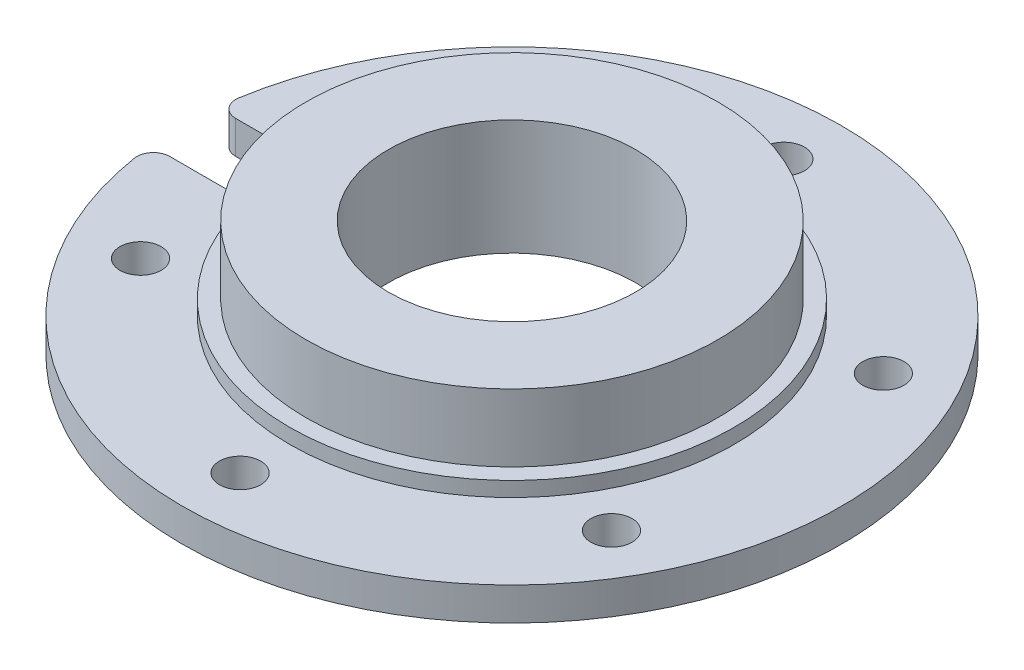
ISO-10303-21;
HEADER;
FILE_DESCRIPTION(('STEP AP214'),'2;1');
FILE_NAME('part.step','',(''),(''),'','','');
FILE_SCHEMA(('AUTOMOTIVE_DESIGN { 1 0 10303 214 1 1 1 1 }'));
ENDSEC;
DATA;
#1=APPLICATION_CONTEXT('core data for automotive mechanical design processes');
#2=APPLICATION_PROTOCOL_DEFINITION('international standard','automotive_design',2000,#1);
#3=PRODUCT_CONTEXT('',#1,'mechanical');
#4=PRODUCT('Part','Part','',(#3));
#5=PRODUCT_RELATED_PRODUCT_CATEGORY('part','',(#4));
#6=PRODUCT_DEFINITION_FORMATION('','',#4);
#7=PRODUCT_DEFINITION_CONTEXT('part definition',#1,'design');
#8=PRODUCT_DEFINITION('design','',#6,#7);
#9=PRODUCT_DEFINITION_SHAPE('','',#8);
#10=(LENGTH_UNIT() NAMED_UNIT(*) SI_UNIT(.MILLI.,.METRE.));
#11=(NAMED_UNIT(*) PLANE_ANGLE_UNIT() SI_UNIT($,.RADIAN.));
#12=(NAMED_UNIT(*) SI_UNIT($,.STERADIAN.) SOLID_ANGLE_UNIT());
#13=UNCERTAINTY_MEASURE_WITH_UNIT(LENGTH_MEASURE(1.E-05),#10,'distance_accuracy_value','');
#14=(GEOMETRIC_REPRESENTATION_CONTEXT(3) GLOBAL_UNCERTAINTY_ASSIGNED_CONTEXT((#13)) GLOBAL_UNIT_ASSIGNED_CONTEXT((#10,
#11,#12)) REPRESENTATION_CONTEXT('',''));
#15=CARTESIAN_POINT('',(0.,0.,0.));
#16=DIRECTION('',(0.,0.,1.));
#17=DIRECTION('',(1.,0.,0.));
#18=AXIS2_PLACEMENT_3D('',#15,#16,#17);
#19=CARTESIAN_POINT('',(0.,0.,0.));
#20=DIRECTION('',(0.,1.,0.));
#21=DIRECTION('',(0.,0.,1.));
#22=AXIS2_PLACEMENT_3D('',#19,#20,#21);
#23=PLANE('',#22);
#24=CARTESIAN_POINT('',(-14.2894191624432,0.,8.25000000000001));
#25=DIRECTION('',(0.,-1.,0.));
#26=DIRECTION('',(0.,0.,-1.));
#27=AXIS2_PLACEMENT_3D('',#24,#25,#26);
#28=CIRCLE('',#27,1.25);
#29=CARTESIAN_POINT('',(-14.2894191624432,0.,7.00000000000001));
#30=VERTEX_POINT('',#29);
#31=EDGE_CURVE('E188',#30,#30,#28,.T.);
#32=ORIENTED_EDGE('',*,*,#31,.F.);
#33=EDGE_LOOP('',(#32));
#34=FACE_BOUND('',#33,.T.);
#35=CARTESIAN_POINT('',(0.,0.,16.5));
#36=DIRECTION('',(0.,-1.,0.));
#37=DIRECTION('',(0.,0.,-1.));
#38=AXIS2_PLACEMENT_3D('',#35,#36,#37);
#39=CIRCLE('',#38,1.25);
#40=CARTESIAN_POINT('',(0.,0.,15.25));
#41=VERTEX_POINT('',#40);
#42=EDGE_CURVE('E172',#41,#41,#39,.T.);
#43=ORIENTED_EDGE('',*,*,#42,.F.);
#44=EDGE_LOOP('',(#43));
#45=FACE_BOUND('',#44,.T.);
#46=CARTESIAN_POINT('',(14.2894191624432,0.,8.25));
#47=DIRECTION('',(0.,-1.,0.));
#48=DIRECTION('',(0.,0.,-1.));
#49=AXIS2_PLACEMENT_3D('',#46,#47,#48);
#50=CIRCLE('',#49,1.25);
#51=CARTESIAN_POINT('',(14.2894191624432,0.,7.));
#52=VERTEX_POINT('',#51);
#53=EDGE_CURVE('E171',#52,#52,#50,.T.);
#54=ORIENTED_EDGE('',*,*,#53,.F.);
#55=EDGE_LOOP('',(#54));
#56=FACE_BOUND('',#55,.T.);
#57=CARTESIAN_POINT('',(14.2894191624432,0.,-8.25));
#58=DIRECTION('',(0.,-1.,0.));
#59=DIRECTION('',(0.,0.,-1.));
#60=AXIS2_PLACEMENT_3D('',#57,#58,#59);
#61=CIRCLE('',#60,1.25);
#62=CARTESIAN_POINT('',(14.2894191624432,0.,-9.5));
#63=VERTEX_POINT('',#62);
#64=EDGE_CURVE('E167',#63,#63,#61,.T.);
#65=ORIENTED_EDGE('',*,*,#64,.F.);
#66=EDGE_LOOP('',(#65));
#67=FACE_BOUND('',#66,.T.);
#68=CARTESIAN_POINT('',(0.,0.,-16.5));
#69=DIRECTION('',(0.,-1.,0.));
#70=DIRECTION('',(0.,0.,-1.));
#71=AXIS2_PLACEMENT_3D('',#68,#69,#70);
#72=CIRCLE('',#71,1.25);
#73=CARTESIAN_POINT('',(0.,0.,-17.75));
#74=VERTEX_POINT('',#73);
#75=EDGE_CURVE('E166',#74,#74,#72,.T.);
#76=ORIENTED_EDGE('',*,*,#75,.F.);
#77=EDGE_LOOP('',(#76));
#78=FACE_BOUND('',#77,.T.);
#79=CARTESIAN_POINT('',(0.,0.,0.));
#80=DIRECTION('',(0.,1.,0.));
#81=DIRECTION('',(0.,0.,1.));
#82=AXIS2_PLACEMENT_3D('',#79,#80,#81);
#83=CIRCLE('',#82,7.5);
#84=CARTESIAN_POINT('',(0.,0.,7.5));
#85=VERTEX_POINT('',#84);
#86=EDGE_CURVE('E246',#85,#85,#83,.T.);
#87=ORIENTED_EDGE('',*,*,#86,.T.);
#88=EDGE_LOOP('',(#87));
#89=FACE_BOUND('',#88,.T.);
#90=CARTESIAN_POINT('',(0.,0.,0.));
#91=DIRECTION('',(0.,1.,0.));
#92=DIRECTION('',(0.,0.,1.));
#93=AXIS2_PLACEMENT_3D('',#90,#91,#92);
#94=CIRCLE('',#93,20.);
#95=CARTESIAN_POINT('',(-19.7491189887302,0.,3.1578947368421));
#96=VERTEX_POINT('',#95);
#97=CARTESIAN_POINT('',(-19.7491189887302,0.,-3.15789473684211));
#98=VERTEX_POINT('',#97);
#99=EDGE_CURVE('E250',#96,#98,#94,.T.);
#100=ORIENTED_EDGE('',*,*,#99,.F.);
#101=CARTESIAN_POINT('',(-18.7616630392937,0.,3.));
#102=DIRECTION('',(0.,1.,0.));
#103=DIRECTION('',(0.,0.,1.));
#104=AXIS2_PLACEMENT_3D('',#101,#102,#103);
#105=CIRCLE('',#104,1.);
#106=CARTESIAN_POINT('',(-18.7616630392937,0.,2.));
#107=VERTEX_POINT('',#106);
#108=EDGE_CURVE('E150',#96,#107,#105,.F.);
#109=ORIENTED_EDGE('',*,*,#108,.T.);
#110=DIRECTION('',(-1.,0.,0.));
#111=VECTOR('',#110,1.);
#112=CARTESIAN_POINT('',(-23.1889342613165,0.,2.));
#113=LINE('',#112,#111);
#114=CARTESIAN_POINT('',(-15.,0.,2.));
#115=VERTEX_POINT('',#114);
#116=EDGE_CURVE('E121',#115,#107,#113,.T.);
#117=ORIENTED_EDGE('',*,*,#116,.F.);
#118=CARTESIAN_POINT('',(-15.,0.,0.999999999999997));
#119=DIRECTION('',(0.,1.,0.));
#120=DIRECTION('',(0.,0.,1.));
#121=AXIS2_PLACEMENT_3D('',#118,#119,#120);
#122=CIRCLE('',#121,1.);
#123=CARTESIAN_POINT('',(-14.,0.,0.999999999999997));
#124=VERTEX_POINT('',#123);
#125=EDGE_CURVE('E156',#115,#124,#122,.T.);
#126=ORIENTED_EDGE('',*,*,#125,.T.);
#127=DIRECTION('',(0.,0.,1.));
#128=VECTOR('',#127,1.);
#129=CARTESIAN_POINT('',(-14.,0.,2.));
#130=LINE('',#129,#128);
#131=CARTESIAN_POINT('',(-14.,0.,-1.));
#132=VERTEX_POINT('',#131);
#133=EDGE_CURVE('E215',#132,#124,#130,.T.);
#134=ORIENTED_EDGE('',*,*,#133,.F.);
#135=CARTESIAN_POINT('',(-15.,0.,-1.));
#136=DIRECTION('',(0.,1.,0.));
#137=DIRECTION('',(0.,0.,1.));
#138=AXIS2_PLACEMENT_3D('',#135,#136,#137);
#139=CIRCLE('',#138,1.);
#140=CARTESIAN_POINT('',(-15.,0.,-2.));
#141=VERTEX_POINT('',#140);
#142=EDGE_CURVE('E55',#132,#141,#139,.T.);
#143=ORIENTED_EDGE('',*,*,#142,.T.);
#144=DIRECTION('',(1.,0.,0.));
#145=VECTOR('',#144,1.);
#146=CARTESIAN_POINT('',(-23.1889342613165,0.,-2.));
#147=LINE('',#146,#145);
#148=CARTESIAN_POINT('',(-18.7616630392937,0.,-2.));
#149=VERTEX_POINT('',#148);
#150=EDGE_CURVE('E212',#149,#141,#147,.T.);
#151=ORIENTED_EDGE('',*,*,#150,.F.);
#152=CARTESIAN_POINT('',(-18.7616630392937,0.,-3.));
#153=DIRECTION('',(0.,1.,0.));
#154=DIRECTION('',(0.,0.,1.));
#155=AXIS2_PLACEMENT_3D('',#152,#153,#154);
#156=CIRCLE('',#155,1.);
#157=EDGE_CURVE('E271',#149,#98,#156,.F.);
#158=ORIENTED_EDGE('',*,*,#157,.T.);
#159=EDGE_LOOP('',(#100,#109,#117,#126,#134,#143,#151,#158));
#160=FACE_BOUND('',#159,.T.);
#161=CARTESIAN_POINT('',(-14.2894191624432,0.,-8.25));
#162=DIRECTION('',(0.,-1.,0.));
#163=DIRECTION('',(0.,0.,-1.));
#164=AXIS2_PLACEMENT_3D('',#161,#162,#163);
#165=CIRCLE('',#164,1.25);
#166=CARTESIAN_POINT('',(-14.2894191624432,0.,-9.5));
#167=VERTEX_POINT('',#166);
#168=EDGE_CURVE('E204',#167,#167,#165,.T.);
#169=ORIENTED_EDGE('',*,*,#168,.F.);
#170=EDGE_LOOP('',(#169));
#171=FACE_BOUND('',#170,.T.);
#172=ADVANCED_FACE('F45',(#34,#45,#56,#67,#78,#89,#160,#171),#23,.F.);
#173=CARTESIAN_POINT('',(0.,2.,0.));
#174=DIRECTION('',(0.,1.,0.));
#175=DIRECTION('',(0.,0.,1.));
#176=AXIS2_PLACEMENT_3D('',#173,#174,#175);
#177=PLANE('',#176);
#178=CARTESIAN_POINT('',(-14.2894191624432,2.,8.25000000000001));
#179=DIRECTION('',(0.,1.,0.));
#180=DIRECTION('',(0.,0.,1.));
#181=AXIS2_PLACEMENT_3D('',#178,#179,#180);
#182=CIRCLE('',#181,1.25);
#183=CARTESIAN_POINT('',(-14.2894191624432,2.,9.50000000000001));
#184=VERTEX_POINT('',#183);
#185=EDGE_CURVE('E49',#184,#184,#182,.T.);
#186=ORIENTED_EDGE('',*,*,#185,.F.);
#187=EDGE_LOOP('',(#186));
#188=FACE_BOUND('',#187,.T.);
#189=CARTESIAN_POINT('',(0.,2.,16.5));
#190=DIRECTION('',(0.,1.,0.));
#191=DIRECTION('',(0.,0.,1.));
#192=AXIS2_PLACEMENT_3D('',#189,#190,#191);
#193=CIRCLE('',#192,1.25);
#194=CARTESIAN_POINT('',(0.,2.,17.75));
#195=VERTEX_POINT('',#194);
#196=EDGE_CURVE('E168',#195,#195,#193,.T.);
#197=ORIENTED_EDGE('',*,*,#196,.F.);
#198=EDGE_LOOP('',(#197));
#199=FACE_BOUND('',#198,.T.);
#200=CARTESIAN_POINT('',(14.2894191624432,2.,8.25));
#201=DIRECTION('',(0.,1.,0.));
#202=DIRECTION('',(0.,0.,1.));
#203=AXIS2_PLACEMENT_3D('',#200,#201,#202);
#204=CIRCLE('',#203,1.25);
#205=CARTESIAN_POINT('',(14.2894191624432,2.,9.49999999999999));
#206=VERTEX_POINT('',#205);
#207=EDGE_CURVE('E179',#206,#206,#204,.T.);
#208=ORIENTED_EDGE('',*,*,#207,.F.);
#209=EDGE_LOOP('',(#208));
#210=FACE_BOUND('',#209,.T.);
#211=CARTESIAN_POINT('',(14.2894191624432,2.,-8.25));
#212=DIRECTION('',(0.,1.,0.));
#213=DIRECTION('',(0.,0.,1.));
#214=AXIS2_PLACEMENT_3D('',#211,#212,#213);
#215=CIRCLE('',#214,1.25);
#216=CARTESIAN_POINT('',(14.2894191624432,2.,-7.));
#217=VERTEX_POINT('',#216);
#218=EDGE_CURVE('E163',#217,#217,#215,.T.);
#219=ORIENTED_EDGE('',*,*,#218,.F.);
#220=EDGE_LOOP('',(#219));
#221=FACE_BOUND('',#220,.T.);
#222=CARTESIAN_POINT('',(0.,2.,-16.5));
#223=DIRECTION('',(0.,1.,0.));
#224=DIRECTION('',(0.,0.,1.));
#225=AXIS2_PLACEMENT_3D('',#222,#223,#224);
#226=CIRCLE('',#225,1.25);
#227=CARTESIAN_POINT('',(0.,2.,-15.25));
#228=VERTEX_POINT('',#227);
#229=EDGE_CURVE('E200',#228,#228,#226,.T.);
#230=ORIENTED_EDGE('',*,*,#229,.F.);
#231=EDGE_LOOP('',(#230));
#232=FACE_BOUND('',#231,.T.);
#233=CARTESIAN_POINT('',(-14.2894191624432,2.,-8.25));
#234=DIRECTION('',(0.,1.,0.));
#235=DIRECTION('',(0.,0.,1.));
#236=AXIS2_PLACEMENT_3D('',#233,#234,#235);
#237=CIRCLE('',#236,1.25);
#238=CARTESIAN_POINT('',(-14.2894191624432,2.,-7.00000000000001));
#239=VERTEX_POINT('',#238);
#240=EDGE_CURVE('E208',#239,#239,#237,.T.);
#241=ORIENTED_EDGE('',*,*,#240,.F.);
#242=EDGE_LOOP('',(#241));
#243=FACE_BOUND('',#242,.T.);
#244=DIRECTION('',(1.,0.,0.));
#245=VECTOR('',#244,1.);
#246=CARTESIAN_POINT('',(0.,2.,2.));
#247=LINE('',#246,#245);
#248=CARTESIAN_POINT('',(-18.7616630392937,2.,2.));
#249=VERTEX_POINT('',#248);
#250=CARTESIAN_POINT('',(-15.,2.,2.));
#251=VERTEX_POINT('',#250);
#252=EDGE_CURVE('E118',#249,#251,#247,.T.);
#253=ORIENTED_EDGE('',*,*,#252,.F.);
#254=CARTESIAN_POINT('',(-18.7616630392937,2.,3.));
#255=DIRECTION('',(0.,1.,0.));
#256=DIRECTION('',(0.,0.,1.));
#257=AXIS2_PLACEMENT_3D('',#254,#255,#256);
#258=CIRCLE('',#257,1.);
#259=CARTESIAN_POINT('',(-19.7491189887302,2.,3.1578947368421));
#260=VERTEX_POINT('',#259);
#261=EDGE_CURVE('E130',#249,#260,#258,.T.);
#262=ORIENTED_EDGE('',*,*,#261,.T.);
#263=CARTESIAN_POINT('',(0.,2.,0.));
#264=DIRECTION('',(0.,1.,0.));
#265=DIRECTION('',(0.,0.,1.));
#266=AXIS2_PLACEMENT_3D('',#263,#264,#265);
#267=CIRCLE('',#266,20.);
#268=CARTESIAN_POINT('',(-19.7491189887302,2.,-3.15789473684211));
#269=VERTEX_POINT('',#268);
#270=EDGE_CURVE('E126',#260,#269,#267,.T.);
#271=ORIENTED_EDGE('',*,*,#270,.T.);
#272=CARTESIAN_POINT('',(-18.7616630392937,2.,-3.));
#273=DIRECTION('',(0.,1.,0.));
#274=DIRECTION('',(0.,0.,1.));
#275=AXIS2_PLACEMENT_3D('',#272,#273,#274);
#276=CIRCLE('',#275,1.);
#277=CARTESIAN_POINT('',(-18.7616630392937,2.,-2.));
#278=VERTEX_POINT('',#277);
#279=EDGE_CURVE('E63',#269,#278,#276,.T.);
#280=ORIENTED_EDGE('',*,*,#279,.T.);
#281=DIRECTION('',(-1.,0.,0.));
#282=VECTOR('',#281,1.);
#283=CARTESIAN_POINT('',(0.,2.,-2.));
#284=LINE('',#283,#282);
#285=CARTESIAN_POINT('',(-15.,2.,-2.));
#286=VERTEX_POINT('',#285);
#287=EDGE_CURVE('E137',#286,#278,#284,.T.);
#288=ORIENTED_EDGE('',*,*,#287,.F.);
#289=CARTESIAN_POINT('',(-15.,2.,-1.));
#290=DIRECTION('',(0.,1.,0.));
#291=DIRECTION('',(0.,0.,1.));
#292=AXIS2_PLACEMENT_3D('',#289,#290,#291);
#293=CIRCLE('',#292,1.);
#294=CARTESIAN_POINT('',(-14.,2.,-1.));
#295=VERTEX_POINT('',#294);
#296=EDGE_CURVE('E11',#286,#295,#293,.F.);
#297=ORIENTED_EDGE('',*,*,#296,.T.);
#298=DIRECTION('',(0.,0.,-1.));
#299=VECTOR('',#298,1.);
#300=CARTESIAN_POINT('',(-14.,2.,0.));
#301=LINE('',#300,#299);
#302=CARTESIAN_POINT('',(-14.,2.,0.999999999999997));
#303=VERTEX_POINT('',#302);
#304=EDGE_CURVE('E136',#303,#295,#301,.T.);
#305=ORIENTED_EDGE('',*,*,#304,.F.);
#306=CARTESIAN_POINT('',(-15.,2.,0.999999999999997));
#307=DIRECTION('',(0.,1.,0.));
#308=DIRECTION('',(0.,0.,1.));
#309=AXIS2_PLACEMENT_3D('',#306,#307,#308);
#310=CIRCLE('',#309,1.);
#311=EDGE_CURVE('E134',#303,#251,#310,.F.);
#312=ORIENTED_EDGE('',*,*,#311,.T.);
#313=EDGE_LOOP('',(#253,#262,#271,#280,#288,#297,#305,#312));
#314=FACE_BOUND('',#313,.T.);
#315=CARTESIAN_POINT('',(0.,2.,0.));
#316=DIRECTION('',(0.,1.,0.));
#317=DIRECTION('',(0.,0.,1.));
#318=AXIS2_PLACEMENT_3D('',#315,#316,#317);
#319=CIRCLE('',#318,13.5);
#320=CARTESIAN_POINT('',(0.,2.,13.5));
#321=VERTEX_POINT('',#320);
#322=EDGE_CURVE('E230',#321,#321,#319,.T.);
#323=ORIENTED_EDGE('',*,*,#322,.F.);
#324=EDGE_LOOP('',(#323));
#325=FACE_BOUND('',#324,.T.);
#326=ADVANCED_FACE('F128',(#188,#199,#210,#221,#232,#243,#314,#325),#177,.T.);
#327=CARTESIAN_POINT('',(0.,2.,0.));
#328=DIRECTION('',(0.,-1.,0.));
#329=DIRECTION('',(0.,0.,-1.));
#330=AXIS2_PLACEMENT_3D('',#327,#328,#329);
#331=CYLINDRICAL_SURFACE('',#330,20.);
#332=ORIENTED_EDGE('',*,*,#270,.F.);
#333=DIRECTION('',(0.,-1.,0.));
#334=VECTOR('',#333,1.);
#335=CARTESIAN_POINT('',(-19.7491189887302,2.,3.1578947368421));
#336=LINE('',#335,#334);
#337=EDGE_CURVE('E142',#260,#96,#336,.T.);
#338=ORIENTED_EDGE('',*,*,#337,.T.);
#339=ORIENTED_EDGE('',*,*,#99,.T.);
#340=DIRECTION('',(0.,-1.,0.));
#341=VECTOR('',#340,1.);
#342=CARTESIAN_POINT('',(-19.7491189887302,2.,-3.15789473684211));
#343=LINE('',#342,#341);
#344=EDGE_CURVE('E265',#98,#269,#343,.F.);
#345=ORIENTED_EDGE('',*,*,#344,.T.);
#346=EDGE_LOOP('',(#332,#338,#339,#345));
#347=FACE_BOUND('',#346,.T.);
#348=ADVANCED_FACE('F279',(#347),#331,.T.);
#349=CARTESIAN_POINT('',(0.,2.,0.));
#350=DIRECTION('',(0.,-1.,0.));
#351=DIRECTION('',(0.,0.,-1.));
#352=AXIS2_PLACEMENT_3D('',#349,#350,#351);
#353=CYLINDRICAL_SURFACE('',#352,7.5);
#354=ORIENTED_EDGE('',*,*,#86,.F.);
#355=EDGE_LOOP('',(#354));
#356=FACE_BOUND('',#355,.T.);
#357=CARTESIAN_POINT('',(0.,7.,0.));
#358=DIRECTION('',(0.,1.,0.));
#359=DIRECTION('',(0.,0.,1.));
#360=AXIS2_PLACEMENT_3D('',#357,#358,#359);
#361=CIRCLE('',#360,7.5);
#362=CARTESIAN_POINT('',(0.,7.,7.5));
#363=VERTEX_POINT('',#362);
#364=EDGE_CURVE('E235',#363,#363,#361,.T.);
#365=ORIENTED_EDGE('',*,*,#364,.T.);
#366=EDGE_LOOP('',(#365));
#367=FACE_BOUND('',#366,.T.);
#368=ADVANCED_FACE('F318',(#356,#367),#353,.F.);
#369=CARTESIAN_POINT('',(0.,7.,0.));
#370=DIRECTION('',(0.,1.,0.));
#371=DIRECTION('',(0.,0.,1.));
#372=AXIS2_PLACEMENT_3D('',#369,#370,#371);
#373=PLANE('',#372);
#374=CARTESIAN_POINT('',(0.,7.,0.));
#375=DIRECTION('',(0.,1.,0.));
#376=DIRECTION('',(0.,0.,1.));
#377=AXIS2_PLACEMENT_3D('',#374,#375,#376);
#378=CIRCLE('',#377,12.5);
#379=CARTESIAN_POINT('',(0.,7.,12.5));
#380=VERTEX_POINT('',#379);
#381=EDGE_CURVE('E242',#380,#380,#378,.T.);
#382=ORIENTED_EDGE('',*,*,#381,.T.);
#383=EDGE_LOOP('',(#382));
#384=FACE_BOUND('',#383,.T.);
#385=ORIENTED_EDGE('',*,*,#364,.F.);
#386=EDGE_LOOP('',(#385));
#387=FACE_BOUND('',#386,.T.);
#388=ADVANCED_FACE('F324',(#384,#387),#373,.T.);
#389=CARTESIAN_POINT('',(0.,7.,0.));
#390=DIRECTION('',(0.,-1.,0.));
#391=DIRECTION('',(0.,0.,-1.));
#392=AXIS2_PLACEMENT_3D('',#389,#390,#391);
#393=CYLINDRICAL_SURFACE('',#392,12.5);
#394=CARTESIAN_POINT('',(0.,2.9,0.));
#395=DIRECTION('',(0.,1.,0.));
#396=DIRECTION('',(0.,0.,1.));
#397=AXIS2_PLACEMENT_3D('',#394,#395,#396);
#398=CIRCLE('',#397,12.5);
#399=CARTESIAN_POINT('',(0.,2.9,12.5));
#400=VERTEX_POINT('',#399);
#401=EDGE_CURVE('E226',#400,#400,#398,.T.);
#402=ORIENTED_EDGE('',*,*,#401,.T.);
#403=EDGE_LOOP('',(#402));
#404=FACE_BOUND('',#403,.T.);
#405=ORIENTED_EDGE('',*,*,#381,.F.);
#406=EDGE_LOOP('',(#405));
#407=FACE_BOUND('',#406,.T.);
#408=ADVANCED_FACE('F329',(#404,#407),#393,.T.);
#409=CARTESIAN_POINT('',(0.,2.9,0.));
#410=DIRECTION('',(0.,1.,0.));
#411=DIRECTION('',(0.,0.,1.));
#412=AXIS2_PLACEMENT_3D('',#409,#410,#411);
#413=PLANE('',#412);
#414=CARTESIAN_POINT('',(0.,2.9,0.));
#415=DIRECTION('',(0.,1.,0.));
#416=DIRECTION('',(0.,0.,1.));
#417=AXIS2_PLACEMENT_3D('',#414,#415,#416);
#418=CIRCLE('',#417,13.5);
#419=CARTESIAN_POINT('',(0.,2.9,13.5));
#420=VERTEX_POINT('',#419);
#421=EDGE_CURVE('E231',#420,#420,#418,.T.);
#422=ORIENTED_EDGE('',*,*,#421,.T.);
#423=EDGE_LOOP('',(#422));
#424=FACE_BOUND('',#423,.T.);
#425=ORIENTED_EDGE('',*,*,#401,.F.);
#426=EDGE_LOOP('',(#425));
#427=FACE_BOUND('',#426,.T.);
#428=ADVANCED_FACE('F336',(#424,#427),#413,.T.);
#429=CARTESIAN_POINT('',(0.,2.9,0.));
#430=DIRECTION('',(0.,-1.,0.));
#431=DIRECTION('',(0.,0.,-1.));
#432=AXIS2_PLACEMENT_3D('',#429,#430,#431);
#433=CYLINDRICAL_SURFACE('',#432,13.5);
#434=ORIENTED_EDGE('',*,*,#421,.F.);
#435=EDGE_LOOP('',(#434));
#436=FACE_BOUND('',#435,.T.);
#437=ORIENTED_EDGE('',*,*,#322,.T.);
#438=EDGE_LOOP('',(#437));
#439=FACE_BOUND('',#438,.T.);
#440=ADVANCED_FACE('F339',(#436,#439),#433,.T.);
#441=CARTESIAN_POINT('',(-23.1889342613165,10.,2.));
#442=DIRECTION('',(0.,0.,1.));
#443=DIRECTION('',(1.,0.,0.));
#444=AXIS2_PLACEMENT_3D('',#441,#442,#443);
#445=PLANE('',#444);
#446=ORIENTED_EDGE('',*,*,#252,.T.);
#447=DIRECTION('',(0.,-1.,0.));
#448=VECTOR('',#447,1.);
#449=CARTESIAN_POINT('',(-15.,0.,2.));
#450=LINE('',#449,#448);
#451=EDGE_CURVE('E125',#251,#115,#450,.T.);
#452=ORIENTED_EDGE('',*,*,#451,.T.);
#453=ORIENTED_EDGE('',*,*,#116,.T.);
#454=DIRECTION('',(0.,-1.,0.));
#455=VECTOR('',#454,1.);
#456=CARTESIAN_POINT('',(-18.7616630392937,10.,2.));
#457=LINE('',#456,#455);
#458=EDGE_CURVE('E114',#107,#249,#457,.F.);
#459=ORIENTED_EDGE('',*,*,#458,.T.);
#460=EDGE_LOOP('',(#446,#452,#453,#459));
#461=FACE_BOUND('',#460,.T.);
#462=ADVANCED_FACE('F116',(#461),#445,.F.);
#463=CARTESIAN_POINT('',(-14.,10.,2.));
#464=DIRECTION('',(1.,0.,0.));
#465=DIRECTION('',(0.,0.,-1.));
#466=AXIS2_PLACEMENT_3D('',#463,#464,#465);
#467=PLANE('',#466);
#468=ORIENTED_EDGE('',*,*,#133,.T.);
#469=DIRECTION('',(0.,-1.,0.));
#470=VECTOR('',#469,1.);
#471=CARTESIAN_POINT('',(-14.,2.,0.999999999999997));
#472=LINE('',#471,#470);
#473=EDGE_CURVE('E262',#124,#303,#472,.F.);
#474=ORIENTED_EDGE('',*,*,#473,.T.);
#475=ORIENTED_EDGE('',*,*,#304,.T.);
#476=DIRECTION('',(0.,-1.,0.));
#477=VECTOR('',#476,1.);
#478=CARTESIAN_POINT('',(-14.,0.,-1.));
#479=LINE('',#478,#477);
#480=EDGE_CURVE('E258',#295,#132,#479,.T.);
#481=ORIENTED_EDGE('',*,*,#480,.T.);
#482=EDGE_LOOP('',(#468,#474,#475,#481));
#483=FACE_BOUND('',#482,.T.);
#484=ADVANCED_FACE('F292',(#483),#467,.F.);
#485=CARTESIAN_POINT('',(-23.1889342613165,10.,-2.));
#486=DIRECTION('',(0.,0.,-1.));
#487=DIRECTION('',(-1.,0.,0.));
#488=AXIS2_PLACEMENT_3D('',#485,#486,#487);
#489=PLANE('',#488);
#490=ORIENTED_EDGE('',*,*,#287,.T.);
#491=DIRECTION('',(0.,-1.,0.));
#492=VECTOR('',#491,1.);
#493=CARTESIAN_POINT('',(-18.7616630392937,10.,-2.));
#494=LINE('',#493,#492);
#495=EDGE_CURVE('E148',#278,#149,#494,.T.);
#496=ORIENTED_EDGE('',*,*,#495,.T.);
#497=ORIENTED_EDGE('',*,*,#150,.T.);
#498=DIRECTION('',(0.,-1.,0.));
#499=VECTOR('',#498,1.);
#500=CARTESIAN_POINT('',(-15.,2.,-2.));
#501=LINE('',#500,#499);
#502=EDGE_CURVE('E70',#141,#286,#501,.F.);
#503=ORIENTED_EDGE('',*,*,#502,.T.);
#504=EDGE_LOOP('',(#490,#496,#497,#503));
#505=FACE_BOUND('',#504,.T.);
#506=ADVANCED_FACE('F286',(#505),#489,.F.);
#507=CARTESIAN_POINT('',(-15.,10.,0.999999999999997));
#508=DIRECTION('',(0.,1.,0.));
#509=DIRECTION('',(0.,0.,1.));
#510=AXIS2_PLACEMENT_3D('',#507,#508,#509);
#511=CYLINDRICAL_SURFACE('',#510,1.);
#512=ORIENTED_EDGE('',*,*,#311,.F.);
#513=ORIENTED_EDGE('',*,*,#473,.F.);
#514=ORIENTED_EDGE('',*,*,#125,.F.);
#515=ORIENTED_EDGE('',*,*,#451,.F.);
#516=EDGE_LOOP('',(#512,#513,#514,#515));
#517=FACE_BOUND('',#516,.T.);
#518=ADVANCED_FACE('F295',(#517),#511,.F.);
#519=CARTESIAN_POINT('',(-18.7616630392937,2.,3.));
#520=DIRECTION('',(0.,-1.,0.));
#521=DIRECTION('',(0.,0.,-1.));
#522=AXIS2_PLACEMENT_3D('',#519,#520,#521);
#523=CYLINDRICAL_SURFACE('',#522,1.);
#524=ORIENTED_EDGE('',*,*,#261,.F.);
#525=ORIENTED_EDGE('',*,*,#458,.F.);
#526=ORIENTED_EDGE('',*,*,#108,.F.);
#527=ORIENTED_EDGE('',*,*,#337,.F.);
#528=EDGE_LOOP('',(#524,#525,#526,#527));
#529=FACE_BOUND('',#528,.T.);
#530=ADVANCED_FACE('F140',(#529),#523,.T.);
#531=CARTESIAN_POINT('',(-18.7616630392937,2.,-3.));
#532=DIRECTION('',(0.,-1.,0.));
#533=DIRECTION('',(0.,0.,-1.));
#534=AXIS2_PLACEMENT_3D('',#531,#532,#533);
#535=CYLINDRICAL_SURFACE('',#534,1.);
#536=ORIENTED_EDGE('',*,*,#157,.F.);
#537=ORIENTED_EDGE('',*,*,#495,.F.);
#538=ORIENTED_EDGE('',*,*,#279,.F.);
#539=ORIENTED_EDGE('',*,*,#344,.F.);
#540=EDGE_LOOP('',(#536,#537,#538,#539));
#541=FACE_BOUND('',#540,.T.);
#542=ADVANCED_FACE('F283',(#541),#535,.T.);
#543=CARTESIAN_POINT('',(-15.,10.,-1.));
#544=DIRECTION('',(0.,1.,0.));
#545=DIRECTION('',(0.,0.,1.));
#546=AXIS2_PLACEMENT_3D('',#543,#544,#545);
#547=CYLINDRICAL_SURFACE('',#546,1.);
#548=ORIENTED_EDGE('',*,*,#296,.F.);
#549=ORIENTED_EDGE('',*,*,#502,.F.);
#550=ORIENTED_EDGE('',*,*,#142,.F.);
#551=ORIENTED_EDGE('',*,*,#480,.F.);
#552=EDGE_LOOP('',(#548,#549,#550,#551));
#553=FACE_BOUND('',#552,.T.);
#554=ADVANCED_FACE('F47',(#553),#547,.F.);
#555=CARTESIAN_POINT('',(-14.2894191624432,0.,-8.25));
#556=DIRECTION('',(0.,-1.,0.));
#557=DIRECTION('',(0.,0.,-1.));
#558=AXIS2_PLACEMENT_3D('',#555,#556,#557);
#559=CYLINDRICAL_SURFACE('',#558,1.25);
#560=ORIENTED_EDGE('',*,*,#240,.T.);
#561=EDGE_LOOP('',(#560));
#562=FACE_BOUND('',#561,.T.);
#563=ORIENTED_EDGE('',*,*,#168,.T.);
#564=EDGE_LOOP('',(#563));
#565=FACE_BOUND('',#564,.T.);
#566=ADVANCED_FACE('F348',(#562,#565),#559,.F.);
#567=CARTESIAN_POINT('',(0.,0.,-16.5));
#568=DIRECTION('',(0.,-1.,0.));
#569=DIRECTION('',(0.,0.,-1.));
#570=AXIS2_PLACEMENT_3D('',#567,#568,#569);
#571=CYLINDRICAL_SURFACE('',#570,1.25);
#572=ORIENTED_EDGE('',*,*,#229,.T.);
#573=EDGE_LOOP('',(#572));
#574=FACE_BOUND('',#573,.T.);
#575=ORIENTED_EDGE('',*,*,#75,.T.);
#576=EDGE_LOOP('',(#575));
#577=FACE_BOUND('',#576,.T.);
#578=ADVANCED_FACE('F351',(#574,#577),#571,.F.);
#579=CARTESIAN_POINT('',(14.2894191624432,0.,-8.25));
#580=DIRECTION('',(0.,-1.,0.));
#581=DIRECTION('',(0.,0.,-1.));
#582=AXIS2_PLACEMENT_3D('',#579,#580,#581);
#583=CYLINDRICAL_SURFACE('',#582,1.25);
#584=ORIENTED_EDGE('',*,*,#218,.T.);
#585=EDGE_LOOP('',(#584));
#586=FACE_BOUND('',#585,.T.);
#587=ORIENTED_EDGE('',*,*,#64,.T.);
#588=EDGE_LOOP('',(#587));
#589=FACE_BOUND('',#588,.T.);
#590=ADVANCED_FACE('F355',(#586,#589),#583,.F.);
#591=CARTESIAN_POINT('',(14.2894191624432,0.,8.25));
#592=DIRECTION('',(0.,-1.,0.));
#593=DIRECTION('',(0.,0.,-1.));
#594=AXIS2_PLACEMENT_3D('',#591,#592,#593);
#595=CYLINDRICAL_SURFACE('',#594,1.25);
#596=ORIENTED_EDGE('',*,*,#207,.T.);
#597=EDGE_LOOP('',(#596));
#598=FACE_BOUND('',#597,.T.);
#599=ORIENTED_EDGE('',*,*,#53,.T.);
#600=EDGE_LOOP('',(#599));
#601=FACE_BOUND('',#600,.T.);
#602=ADVANCED_FACE('F359',(#598,#601),#595,.F.);
#603=CARTESIAN_POINT('',(0.,0.,16.5));
#604=DIRECTION('',(0.,-1.,0.));
#605=DIRECTION('',(0.,0.,-1.));
#606=AXIS2_PLACEMENT_3D('',#603,#604,#605);
#607=CYLINDRICAL_SURFACE('',#606,1.25);
#608=ORIENTED_EDGE('',*,*,#196,.T.);
#609=EDGE_LOOP('',(#608));
#610=FACE_BOUND('',#609,.T.);
#611=ORIENTED_EDGE('',*,*,#42,.T.);
#612=EDGE_LOOP('',(#611));
#613=FACE_BOUND('',#612,.T.);
#614=ADVANCED_FACE('F363',(#610,#613),#607,.F.);
#615=CARTESIAN_POINT('',(-14.2894191624432,0.,8.25000000000001));
#616=DIRECTION('',(0.,-1.,0.));
#617=DIRECTION('',(0.,0.,-1.));
#618=AXIS2_PLACEMENT_3D('',#615,#616,#617);
#619=CYLINDRICAL_SURFACE('',#618,1.25);
#620=ORIENTED_EDGE('',*,*,#185,.T.);
#621=EDGE_LOOP('',(#620));
#622=FACE_BOUND('',#621,.T.);
#623=ORIENTED_EDGE('',*,*,#31,.T.);
#624=EDGE_LOOP('',(#623));
#625=FACE_BOUND('',#624,.T.);
#626=ADVANCED_FACE('F367',(#622,#625),#619,.F.);
#627=CLOSED_SHELL('',(#172,#326,#348,#368,#388,#408,#428,#440,#462,#484,#506,#518,#530,#542,
#554,#566,#578,#590,#602,#614,#626));
#628=MANIFOLD_SOLID_BREP('B2',#627);
#629=ADVANCED_BREP_SHAPE_REPRESENTATION('',(#18,#628),#14);
#630=SHAPE_DEFINITION_REPRESENTATION(#9,#629);
ENDSEC;
END-ISO-10303-21;
